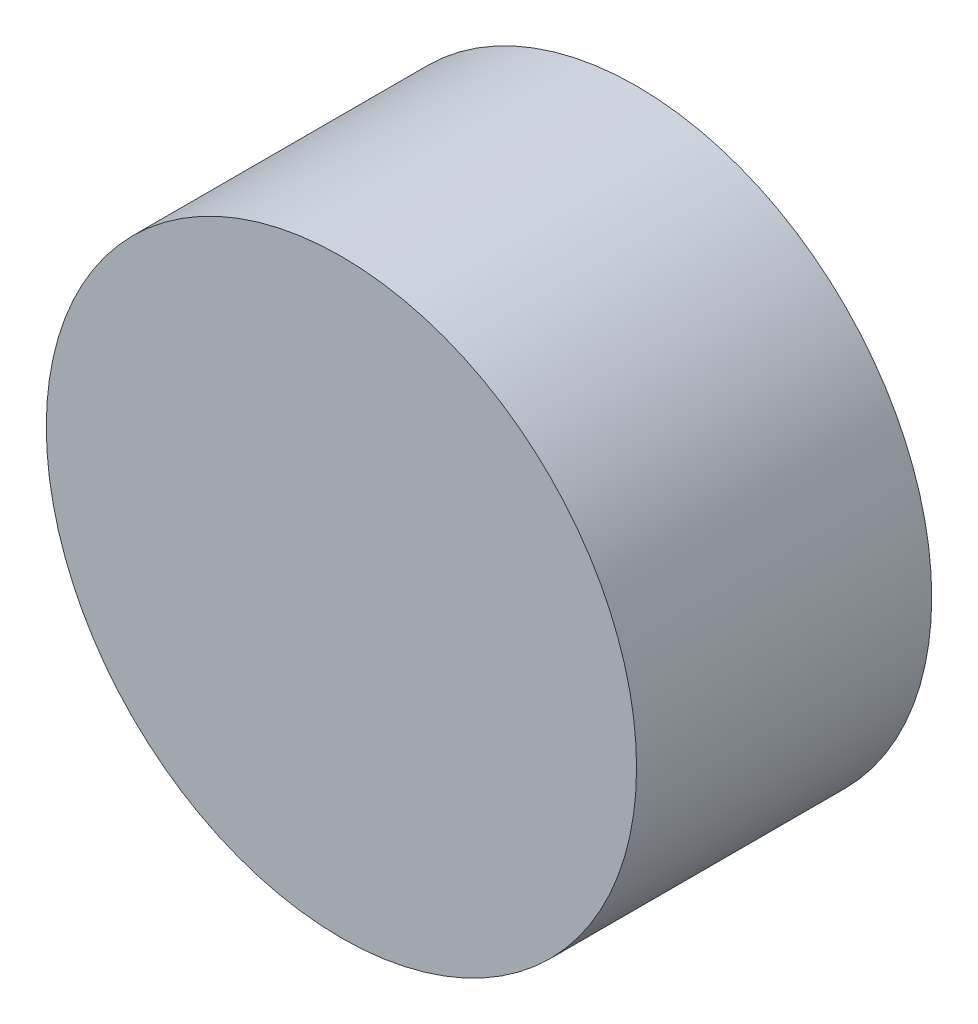
ISO-10303-21;
HEADER;
FILE_DESCRIPTION(('STEP AP214'),'2;1');
FILE_NAME('part.step','',(''),(''),'','','');
FILE_SCHEMA(('AUTOMOTIVE_DESIGN { 1 0 10303 214 1 1 1 1 }'));
ENDSEC;
DATA;
#1=APPLICATION_CONTEXT('core data for automotive mechanical design processes');
#2=APPLICATION_PROTOCOL_DEFINITION('international standard','automotive_design',2000,#1);
#3=PRODUCT_CONTEXT('',#1,'mechanical');
#4=PRODUCT('Part','Part','',(#3));
#5=PRODUCT_RELATED_PRODUCT_CATEGORY('part','',(#4));
#6=PRODUCT_DEFINITION_FORMATION('','',#4);
#7=PRODUCT_DEFINITION_CONTEXT('part definition',#1,'design');
#8=PRODUCT_DEFINITION('design','',#6,#7);
#9=PRODUCT_DEFINITION_SHAPE('','',#8);
#10=(LENGTH_UNIT() NAMED_UNIT(*) SI_UNIT(.MILLI.,.METRE.));
#11=(NAMED_UNIT(*) PLANE_ANGLE_UNIT() SI_UNIT($,.RADIAN.));
#12=(NAMED_UNIT(*) SI_UNIT($,.STERADIAN.) SOLID_ANGLE_UNIT());
#13=UNCERTAINTY_MEASURE_WITH_UNIT(LENGTH_MEASURE(1.E-05),#10,'distance_accuracy_value','');
#14=(GEOMETRIC_REPRESENTATION_CONTEXT(3) GLOBAL_UNCERTAINTY_ASSIGNED_CONTEXT((#13)) GLOBAL_UNIT_ASSIGNED_CONTEXT((#10,
#11,#12)) REPRESENTATION_CONTEXT('',''));
#15=CARTESIAN_POINT('',(0.,0.,0.));
#16=DIRECTION('',(0.,0.,1.));
#17=DIRECTION('',(1.,0.,0.));
#18=AXIS2_PLACEMENT_3D('',#15,#16,#17);
#19=CARTESIAN_POINT('',(0.,0.,5.));
#20=DIRECTION('',(0.,0.,-1.));
#21=DIRECTION('',(-1.,0.,0.));
#22=AXIS2_PLACEMENT_3D('',#19,#20,#21);
#23=CYLINDRICAL_SURFACE('',#22,5.);
#24=CARTESIAN_POINT('',(0.,0.,5.));
#25=DIRECTION('',(0.,0.,1.));
#26=DIRECTION('',(1.,0.,0.));
#27=AXIS2_PLACEMENT_3D('',#24,#25,#26);
#28=CIRCLE('',#27,5.);
#29=CARTESIAN_POINT('',(5.,0.,5.));
#30=VERTEX_POINT('',#29);
#31=EDGE_CURVE('E11',#30,#30,#28,.T.);
#32=ORIENTED_EDGE('',*,*,#31,.F.);
#33=EDGE_LOOP('',(#32));
#34=FACE_BOUND('',#33,.T.);
#35=CARTESIAN_POINT('',(0.,0.,0.));
#36=DIRECTION('',(0.,0.,1.));
#37=DIRECTION('',(1.,0.,0.));
#38=AXIS2_PLACEMENT_3D('',#35,#36,#37);
#39=CIRCLE('',#38,5.);
#40=CARTESIAN_POINT('',(5.,0.,0.));
#41=VERTEX_POINT('',#40);
#42=EDGE_CURVE('E48',#41,#41,#39,.T.);
#43=ORIENTED_EDGE('',*,*,#42,.T.);
#44=EDGE_LOOP('',(#43));
#45=FACE_BOUND('',#44,.T.);
#46=ADVANCED_FACE('F44',(#34,#45),#23,.T.);
#47=CARTESIAN_POINT('',(0.,0.,5.));
#48=DIRECTION('',(0.,0.,1.));
#49=DIRECTION('',(1.,0.,0.));
#50=AXIS2_PLACEMENT_3D('',#47,#48,#49);
#51=PLANE('',#50);
#52=ORIENTED_EDGE('',*,*,#31,.T.);
#53=EDGE_LOOP('',(#52));
#54=FACE_BOUND('',#53,.T.);
#55=ADVANCED_FACE('F142',(#54),#51,.T.);
#56=CARTESIAN_POINT('',(0.,0.,0.));
#57=DIRECTION('',(0.,0.,1.));
#58=DIRECTION('',(1.,0.,0.));
#59=AXIS2_PLACEMENT_3D('',#56,#57,#58);
#60=PLANE('',#59);
#61=DIRECTION('',(0.,-1.,0.));
#62=VECTOR('',#61,1.);
#63=CARTESIAN_POINT('',(-1.25,1.,0.));
#64=LINE('',#63,#62);
#65=CARTESIAN_POINT('',(-1.25,1.,0.));
#66=VERTEX_POINT('',#65);
#67=CARTESIAN_POINT('',(-1.25,-1.,0.));
#68=VERTEX_POINT('',#67);
#69=EDGE_CURVE('E105',#66,#68,#64,.T.);
#70=ORIENTED_EDGE('',*,*,#69,.T.);
#71=DIRECTION('',(1.,0.,0.));
#72=VECTOR('',#71,1.);
#73=CARTESIAN_POINT('',(-1.25,-1.,0.));
#74=LINE('',#73,#72);
#75=CARTESIAN_POINT('',(1.25,-1.,0.));
#76=VERTEX_POINT('',#75);
#77=EDGE_CURVE('E58',#68,#76,#74,.T.);
#78=ORIENTED_EDGE('',*,*,#77,.T.);
#79=DIRECTION('',(0.,-1.,0.));
#80=VECTOR('',#79,1.);
#81=CARTESIAN_POINT('',(1.25,1.,0.));
#82=LINE('',#81,#80);
#83=CARTESIAN_POINT('',(1.25,1.,0.));
#84=VERTEX_POINT('',#83);
#85=EDGE_CURVE('E108',#84,#76,#82,.T.);
#86=ORIENTED_EDGE('',*,*,#85,.F.);
#87=DIRECTION('',(1.,0.,0.));
#88=VECTOR('',#87,1.);
#89=CARTESIAN_POINT('',(-1.25,1.,0.));
#90=LINE('',#89,#88);
#91=EDGE_CURVE('E91',#66,#84,#90,.T.);
#92=ORIENTED_EDGE('',*,*,#91,.F.);
#93=EDGE_LOOP('',(#70,#78,#86,#92));
#94=FACE_BOUND('',#93,.T.);
#95=ORIENTED_EDGE('',*,*,#42,.F.);
#96=EDGE_LOOP('',(#95));
#97=FACE_BOUND('',#96,.T.);
#98=ADVANCED_FACE('F111',(#94,#97),#60,.F.);
#99=CARTESIAN_POINT('',(0.,1.,-1.5));
#100=DIRECTION('',(0.,1.,0.));
#101=DIRECTION('',(0.,0.,1.));
#102=AXIS2_PLACEMENT_3D('',#99,#100,#101);
#103=PLANE('',#102);
#104=CARTESIAN_POINT('',(0.,1.,-1.5));
#105=DIRECTION('',(0.,1.,0.));
#106=DIRECTION('',(0.,0.,1.));
#107=AXIS2_PLACEMENT_3D('',#104,#105,#106);
#108=CIRCLE('',#107,1.25);
#109=CARTESIAN_POINT('',(1.25,1.,-1.5));
#110=VERTEX_POINT('',#109);
#111=CARTESIAN_POINT('',(-1.25,1.,-1.5));
#112=VERTEX_POINT('',#111);
#113=EDGE_CURVE('E97',#110,#112,#108,.T.);
#114=ORIENTED_EDGE('',*,*,#113,.T.);
#115=DIRECTION('',(0.,0.,1.));
#116=VECTOR('',#115,1.);
#117=CARTESIAN_POINT('',(-1.25,1.,-1.5));
#118=LINE('',#117,#116);
#119=EDGE_CURVE('E93',#112,#66,#118,.T.);
#120=ORIENTED_EDGE('',*,*,#119,.T.);
#121=ORIENTED_EDGE('',*,*,#91,.T.);
#122=DIRECTION('',(0.,0.,-1.));
#123=VECTOR('',#122,1.);
#124=CARTESIAN_POINT('',(1.25,1.,0.));
#125=LINE('',#124,#123);
#126=EDGE_CURVE('E68',#84,#110,#125,.T.);
#127=ORIENTED_EDGE('',*,*,#126,.T.);
#128=EDGE_LOOP('',(#114,#120,#121,#127));
#129=FACE_BOUND('',#128,.T.);
#130=CARTESIAN_POINT('',(0.,1.,-1.5));
#131=DIRECTION('',(0.,1.,0.));
#132=DIRECTION('',(0.,0.,1.));
#133=AXIS2_PLACEMENT_3D('',#130,#131,#132);
#134=CIRCLE('',#133,0.5);
#135=CARTESIAN_POINT('',(0.,1.,-1.));
#136=VERTEX_POINT('',#135);
#137=EDGE_CURVE('E121',#136,#136,#134,.T.);
#138=ORIENTED_EDGE('',*,*,#137,.F.);
#139=EDGE_LOOP('',(#138));
#140=FACE_BOUND('',#139,.T.);
#141=ADVANCED_FACE('F94',(#129,#140),#103,.T.);
#142=CARTESIAN_POINT('',(0.,-1.,-1.5));
#143=DIRECTION('',(0.,1.,0.));
#144=DIRECTION('',(0.,0.,1.));
#145=AXIS2_PLACEMENT_3D('',#142,#143,#144);
#146=PLANE('',#145);
#147=CARTESIAN_POINT('',(0.,-1.,-1.5));
#148=DIRECTION('',(0.,1.,0.));
#149=DIRECTION('',(0.,0.,1.));
#150=AXIS2_PLACEMENT_3D('',#147,#148,#149);
#151=CIRCLE('',#150,1.25);
#152=CARTESIAN_POINT('',(1.25,-1.,-1.5));
#153=VERTEX_POINT('',#152);
#154=CARTESIAN_POINT('',(-1.25,-1.,-1.5));
#155=VERTEX_POINT('',#154);
#156=EDGE_CURVE('E119',#153,#155,#151,.T.);
#157=ORIENTED_EDGE('',*,*,#156,.F.);
#158=DIRECTION('',(0.,0.,-1.));
#159=VECTOR('',#158,1.);
#160=CARTESIAN_POINT('',(1.25,-1.,0.));
#161=LINE('',#160,#159);
#162=EDGE_CURVE('E84',#76,#153,#161,.T.);
#163=ORIENTED_EDGE('',*,*,#162,.F.);
#164=ORIENTED_EDGE('',*,*,#77,.F.);
#165=DIRECTION('',(0.,0.,1.));
#166=VECTOR('',#165,1.);
#167=CARTESIAN_POINT('',(-1.25,-1.,-1.5));
#168=LINE('',#167,#166);
#169=EDGE_CURVE('E104',#155,#68,#168,.T.);
#170=ORIENTED_EDGE('',*,*,#169,.F.);
#171=EDGE_LOOP('',(#157,#163,#164,#170));
#172=FACE_BOUND('',#171,.T.);
#173=CARTESIAN_POINT('',(0.,-1.,-1.5));
#174=DIRECTION('',(0.,1.,0.));
#175=DIRECTION('',(0.,0.,1.));
#176=AXIS2_PLACEMENT_3D('',#173,#174,#175);
#177=CIRCLE('',#176,0.5);
#178=CARTESIAN_POINT('',(0.,-1.,-1.));
#179=VERTEX_POINT('',#178);
#180=EDGE_CURVE('E225',#179,#179,#177,.T.);
#181=ORIENTED_EDGE('',*,*,#180,.T.);
#182=EDGE_LOOP('',(#181));
#183=FACE_BOUND('',#182,.T.);
#184=ADVANCED_FACE('F147',(#172,#183),#146,.F.);
#185=CARTESIAN_POINT('',(0.,1.,-1.5));
#186=DIRECTION('',(0.,-1.,0.));
#187=DIRECTION('',(0.,0.,-1.));
#188=AXIS2_PLACEMENT_3D('',#185,#186,#187);
#189=CYLINDRICAL_SURFACE('',#188,1.25);
#190=ORIENTED_EDGE('',*,*,#156,.T.);
#191=DIRECTION('',(0.,-1.,0.));
#192=VECTOR('',#191,1.);
#193=CARTESIAN_POINT('',(-1.25,1.,-1.5));
#194=LINE('',#193,#192);
#195=EDGE_CURVE('E110',#112,#155,#194,.T.);
#196=ORIENTED_EDGE('',*,*,#195,.F.);
#197=ORIENTED_EDGE('',*,*,#113,.F.);
#198=DIRECTION('',(0.,-1.,0.));
#199=VECTOR('',#198,1.);
#200=CARTESIAN_POINT('',(1.25,1.,-1.5));
#201=LINE('',#200,#199);
#202=EDGE_CURVE('E116',#110,#153,#201,.T.);
#203=ORIENTED_EDGE('',*,*,#202,.T.);
#204=EDGE_LOOP('',(#190,#196,#197,#203));
#205=FACE_BOUND('',#204,.T.);
#206=ADVANCED_FACE('F179',(#205),#189,.T.);
#207=CARTESIAN_POINT('',(-1.25,1.,-1.5));
#208=DIRECTION('',(1.,0.,0.));
#209=DIRECTION('',(0.,0.,-1.));
#210=AXIS2_PLACEMENT_3D('',#207,#208,#209);
#211=PLANE('',#210);
#212=ORIENTED_EDGE('',*,*,#169,.T.);
#213=ORIENTED_EDGE('',*,*,#69,.F.);
#214=ORIENTED_EDGE('',*,*,#119,.F.);
#215=ORIENTED_EDGE('',*,*,#195,.T.);
#216=EDGE_LOOP('',(#212,#213,#214,#215));
#217=FACE_BOUND('',#216,.T.);
#218=ADVANCED_FACE('F101',(#217),#211,.F.);
#219=CARTESIAN_POINT('',(1.25,1.,0.));
#220=DIRECTION('',(-1.,0.,0.));
#221=DIRECTION('',(0.,0.,1.));
#222=AXIS2_PLACEMENT_3D('',#219,#220,#221);
#223=PLANE('',#222);
#224=ORIENTED_EDGE('',*,*,#162,.T.);
#225=ORIENTED_EDGE('',*,*,#202,.F.);
#226=ORIENTED_EDGE('',*,*,#126,.F.);
#227=ORIENTED_EDGE('',*,*,#85,.T.);
#228=EDGE_LOOP('',(#224,#225,#226,#227));
#229=FACE_BOUND('',#228,.T.);
#230=ADVANCED_FACE('F200',(#229),#223,.F.);
#231=CARTESIAN_POINT('',(0.,1.,-1.5));
#232=DIRECTION('',(0.,-1.,0.));
#233=DIRECTION('',(0.,0.,-1.));
#234=AXIS2_PLACEMENT_3D('',#231,#232,#233);
#235=CYLINDRICAL_SURFACE('',#234,0.5);
#236=ORIENTED_EDGE('',*,*,#137,.T.);
#237=EDGE_LOOP('',(#236));
#238=FACE_BOUND('',#237,.T.);
#239=ORIENTED_EDGE('',*,*,#180,.F.);
#240=EDGE_LOOP('',(#239));
#241=FACE_BOUND('',#240,.T.);
#242=ADVANCED_FACE('F210',(#238,#241),#235,.F.);
#243=CLOSED_SHELL('',(#46,#55,#98,#141,#184,#206,#218,#230,#242));
#244=MANIFOLD_SOLID_BREP('B2',#243);
#245=ADVANCED_BREP_SHAPE_REPRESENTATION('',(#18,#244),#14);
#246=SHAPE_DEFINITION_REPRESENTATION(#9,#245);
ENDSEC;
END-ISO-10303-21;
